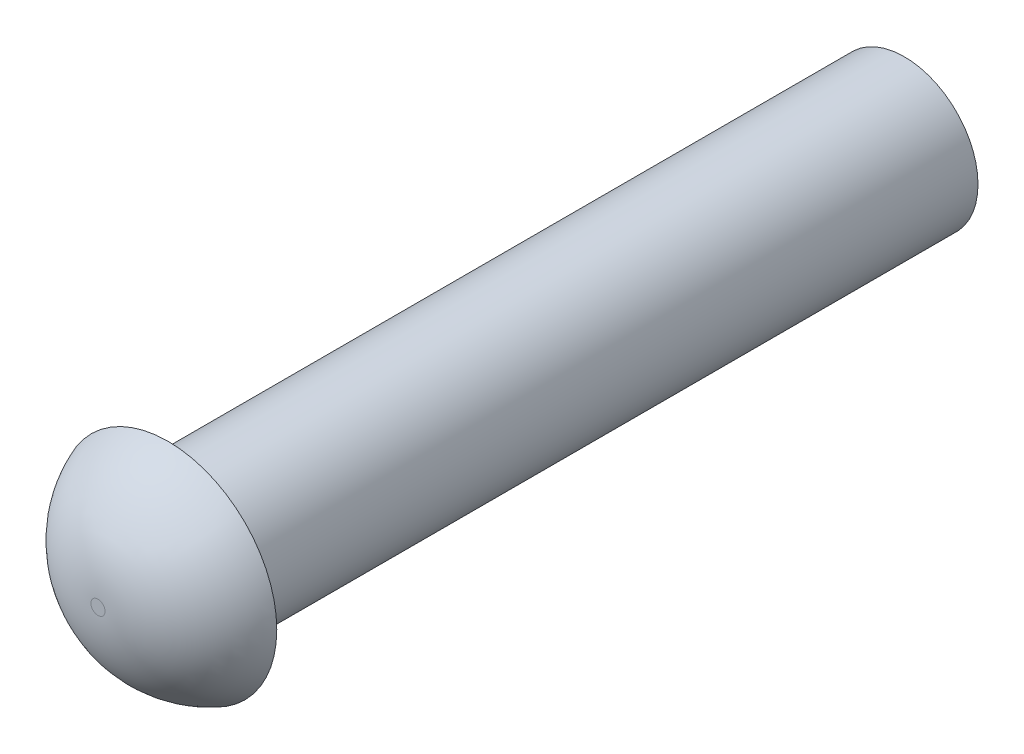
ISO-10303-21;
HEADER;
FILE_DESCRIPTION(('STEP AP214'),'2;1');
FILE_NAME('part.step','',(''),(''),'','','');
FILE_SCHEMA(('AUTOMOTIVE_DESIGN { 1 0 10303 214 1 1 1 1 }'));
ENDSEC;
DATA;
#1=APPLICATION_CONTEXT('core data for automotive mechanical design processes');
#2=APPLICATION_PROTOCOL_DEFINITION('international standard','automotive_design',2000,#1);
#3=PRODUCT_CONTEXT('',#1,'mechanical');
#4=PRODUCT('Part','Part','',(#3));
#5=PRODUCT_RELATED_PRODUCT_CATEGORY('part','',(#4));
#6=PRODUCT_DEFINITION_FORMATION('','',#4);
#7=PRODUCT_DEFINITION_CONTEXT('part definition',#1,'design');
#8=PRODUCT_DEFINITION('design','',#6,#7);
#9=PRODUCT_DEFINITION_SHAPE('','',#8);
#10=(LENGTH_UNIT() NAMED_UNIT(*) SI_UNIT(.MILLI.,.METRE.));
#11=(NAMED_UNIT(*) PLANE_ANGLE_UNIT() SI_UNIT($,.RADIAN.));
#12=(NAMED_UNIT(*) SI_UNIT($,.STERADIAN.) SOLID_ANGLE_UNIT());
#13=UNCERTAINTY_MEASURE_WITH_UNIT(LENGTH_MEASURE(1.E-05),#10,'distance_accuracy_value','');
#14=(GEOMETRIC_REPRESENTATION_CONTEXT(3) GLOBAL_UNCERTAINTY_ASSIGNED_CONTEXT((#13)) GLOBAL_UNIT_ASSIGNED_CONTEXT((#10,
#11,#12)) REPRESENTATION_CONTEXT('',''));
#15=CARTESIAN_POINT('',(0.,0.,0.));
#16=DIRECTION('',(0.,0.,1.));
#17=DIRECTION('',(1.,0.,0.));
#18=AXIS2_PLACEMENT_3D('',#15,#16,#17);
#19=CARTESIAN_POINT('',(0.,0.,-4.));
#20=DIRECTION('',(0.,0.,1.));
#21=DIRECTION('',(1.,0.,0.));
#22=AXIS2_PLACEMENT_3D('',#19,#20,#21);
#23=CYLINDRICAL_SURFACE('',#22,1.05);
#24=CARTESIAN_POINT('',(0.,0.,-4.));
#25=DIRECTION('',(0.,0.,1.));
#26=DIRECTION('',(1.,0.,0.));
#27=AXIS2_PLACEMENT_3D('',#24,#25,#26);
#28=CIRCLE('',#27,1.05);
#29=CARTESIAN_POINT('',(1.05,0.,-4.));
#30=VERTEX_POINT('',#29);
#31=EDGE_CURVE('E51',#30,#30,#28,.T.);
#32=ORIENTED_EDGE('',*,*,#31,.T.);
#33=EDGE_LOOP('',(#32));
#34=FACE_BOUND('',#33,.T.);
#35=CARTESIAN_POINT('',(0.,0.,6.5));
#36=DIRECTION('',(0.,0.,1.));
#37=DIRECTION('',(1.,0.,0.));
#38=AXIS2_PLACEMENT_3D('',#35,#36,#37);
#39=CIRCLE('',#38,1.05);
#40=CARTESIAN_POINT('',(1.05,0.,6.5));
#41=VERTEX_POINT('',#40);
#42=EDGE_CURVE('E56',#41,#41,#39,.T.);
#43=ORIENTED_EDGE('',*,*,#42,.F.);
#44=EDGE_LOOP('',(#43));
#45=FACE_BOUND('',#44,.T.);
#46=ADVANCED_FACE('F43',(#34,#45),#23,.T.);
#47=CARTESIAN_POINT('',(0.,0.,-4.));
#48=DIRECTION('',(0.,0.,1.));
#49=DIRECTION('',(1.,0.,0.));
#50=AXIS2_PLACEMENT_3D('',#47,#48,#49);
#51=PLANE('',#50);
#52=ORIENTED_EDGE('',*,*,#31,.F.);
#53=EDGE_LOOP('',(#52));
#54=FACE_BOUND('',#53,.T.);
#55=ADVANCED_FACE('F80',(#54),#51,.F.);
#56=CARTESIAN_POINT('',(0.,0.,7.5));
#57=DIRECTION('',(0.,0.,1.));
#58=DIRECTION('',(1.,0.,0.));
#59=AXIS2_PLACEMENT_3D('',#56,#57,#58);
#60=PLANE('',#59);
#61=CARTESIAN_POINT('',(0.,0.,7.5));
#62=DIRECTION('',(0.,0.,1.));
#63=DIRECTION('',(1.,0.,0.));
#64=AXIS2_PLACEMENT_3D('',#61,#62,#63);
#65=CIRCLE('',#64,0.100862325381056);
#66=CARTESIAN_POINT('',(0.100862325381056,0.,7.5));
#67=VERTEX_POINT('',#66);
#68=EDGE_CURVE('E10',#67,#67,#65,.T.);
#69=ORIENTED_EDGE('',*,*,#68,.T.);
#70=EDGE_LOOP('',(#69));
#71=FACE_BOUND('',#70,.T.);
#72=ADVANCED_FACE('F72',(#71),#60,.T.);
#73=CARTESIAN_POINT('',(0.,0.,6.5));
#74=DIRECTION('',(0.,0.,1.));
#75=DIRECTION('',(1.,0.,0.));
#76=AXIS2_PLACEMENT_3D('',#73,#74,#75);
#77=PLANE('',#76);
#78=ORIENTED_EDGE('',*,*,#42,.T.);
#79=EDGE_LOOP('',(#78));
#80=FACE_BOUND('',#79,.T.);
#81=CARTESIAN_POINT('',(0.,0.,6.5));
#82=DIRECTION('',(0.,0.,1.));
#83=DIRECTION('',(1.,0.,0.));
#84=AXIS2_PLACEMENT_3D('',#81,#82,#83);
#85=CIRCLE('',#84,1.55);
#86=CARTESIAN_POINT('',(1.55,0.,6.5));
#87=VERTEX_POINT('',#86);
#88=EDGE_CURVE('E61',#87,#87,#85,.T.);
#89=ORIENTED_EDGE('',*,*,#88,.F.);
#90=EDGE_LOOP('',(#89));
#91=FACE_BOUND('',#90,.T.);
#92=ADVANCED_FACE('F70',(#80,#91),#77,.F.);
#93=CARTESIAN_POINT('',(0.,0.,5.95));
#94=DIRECTION('',(0.,0.,-1.));
#95=DIRECTION('',(-1.,0.,0.));
#96=AXIS2_PLACEMENT_3D('',#93,#94,#95);
#97=DEGENERATE_TOROIDAL_SURFACE('',#96,0.100862325381056,1.55,.T.);
#98=ORIENTED_EDGE('',*,*,#88,.T.);
#99=EDGE_LOOP('',(#98));
#100=FACE_BOUND('',#99,.T.);
#101=ORIENTED_EDGE('',*,*,#68,.F.);
#102=EDGE_LOOP('',(#101));
#103=FACE_BOUND('',#102,.T.);
#104=ADVANCED_FACE('F45',(#100,#103),#97,.T.);
#105=CLOSED_SHELL('',(#46,#55,#72,#92,#104));
#106=MANIFOLD_SOLID_BREP('B2',#105);
#107=ADVANCED_BREP_SHAPE_REPRESENTATION('',(#18,#106),#14);
#108=SHAPE_DEFINITION_REPRESENTATION(#9,#107);
ENDSEC;
END-ISO-10303-21;
